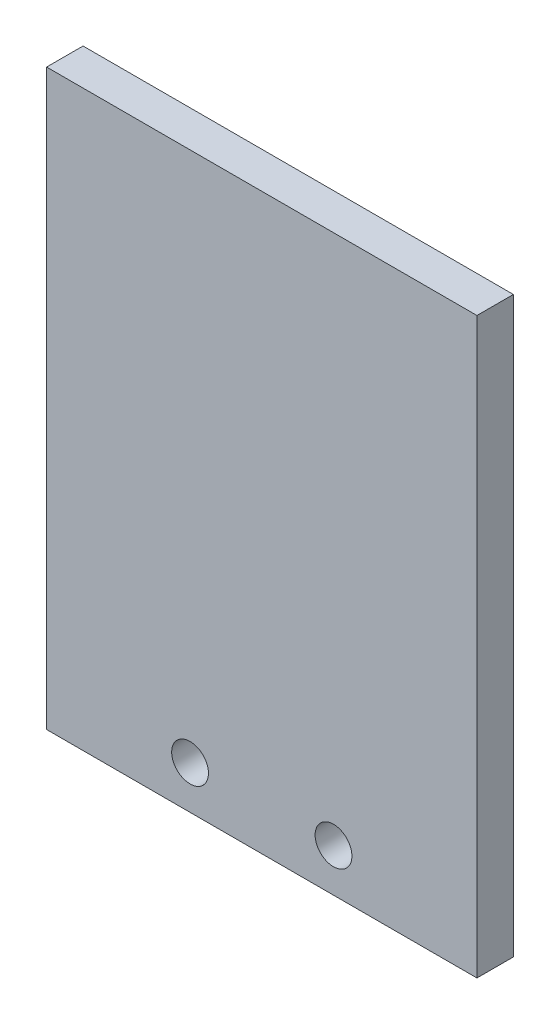
ISO-10303-21;
HEADER;
FILE_DESCRIPTION(('STEP AP214'),'2;1');
FILE_NAME('part.step','',(''),(''),'','','');
FILE_SCHEMA(('AUTOMOTIVE_DESIGN { 1 0 10303 214 1 1 1 1 }'));
ENDSEC;
DATA;
#1=APPLICATION_CONTEXT('core data for automotive mechanical design processes');
#2=APPLICATION_PROTOCOL_DEFINITION('international standard','automotive_design',2000,#1);
#3=PRODUCT_CONTEXT('',#1,'mechanical');
#4=PRODUCT('Part','Part','',(#3));
#5=PRODUCT_RELATED_PRODUCT_CATEGORY('part','',(#4));
#6=PRODUCT_DEFINITION_FORMATION('','',#4);
#7=PRODUCT_DEFINITION_CONTEXT('part definition',#1,'design');
#8=PRODUCT_DEFINITION('design','',#6,#7);
#9=PRODUCT_DEFINITION_SHAPE('','',#8);
#10=(LENGTH_UNIT() NAMED_UNIT(*) SI_UNIT(.MILLI.,.METRE.));
#11=(NAMED_UNIT(*) PLANE_ANGLE_UNIT() SI_UNIT($,.RADIAN.));
#12=(NAMED_UNIT(*) SI_UNIT($,.STERADIAN.) SOLID_ANGLE_UNIT());
#13=UNCERTAINTY_MEASURE_WITH_UNIT(LENGTH_MEASURE(1.E-05),#10,'distance_accuracy_value','');
#14=(GEOMETRIC_REPRESENTATION_CONTEXT(3) GLOBAL_UNCERTAINTY_ASSIGNED_CONTEXT((#13)) GLOBAL_UNIT_ASSIGNED_CONTEXT((#10,
#11,#12)) REPRESENTATION_CONTEXT('',''));
#15=CARTESIAN_POINT('',(0.,0.,0.));
#16=DIRECTION('',(0.,0.,1.));
#17=DIRECTION('',(1.,0.,0.));
#18=AXIS2_PLACEMENT_3D('',#15,#16,#17);
#19=CARTESIAN_POINT('',(0.,0.,12.7));
#20=DIRECTION('',(1.,0.,0.));
#21=DIRECTION('',(0.,0.,-1.));
#22=AXIS2_PLACEMENT_3D('',#19,#20,#21);
#23=PLANE('',#22);
#24=DIRECTION('',(0.,-1.,0.));
#25=VECTOR('',#24,1.);
#26=CARTESIAN_POINT('',(0.,0.,0.));
#27=LINE('',#26,#25);
#28=CARTESIAN_POINT('',(0.,200.,0.));
#29=VERTEX_POINT('',#28);
#30=CARTESIAN_POINT('',(0.,0.,0.));
#31=VERTEX_POINT('',#30);
#32=EDGE_CURVE('E96',#29,#31,#27,.T.);
#33=ORIENTED_EDGE('',*,*,#32,.T.);
#34=DIRECTION('',(0.,0.,-1.));
#35=VECTOR('',#34,1.);
#36=CARTESIAN_POINT('',(0.,0.,12.7));
#37=LINE('',#36,#35);
#38=CARTESIAN_POINT('',(0.,0.,12.7));
#39=VERTEX_POINT('',#38);
#40=EDGE_CURVE('E11',#39,#31,#37,.T.);
#41=ORIENTED_EDGE('',*,*,#40,.F.);
#42=DIRECTION('',(0.,-1.,0.));
#43=VECTOR('',#42,1.);
#44=CARTESIAN_POINT('',(0.,0.,12.7));
#45=LINE('',#44,#43);
#46=CARTESIAN_POINT('',(0.,200.,12.7));
#47=VERTEX_POINT('',#46);
#48=EDGE_CURVE('E84',#47,#39,#45,.T.);
#49=ORIENTED_EDGE('',*,*,#48,.F.);
#50=DIRECTION('',(0.,0.,-1.));
#51=VECTOR('',#50,1.);
#52=CARTESIAN_POINT('',(0.,200.,12.7));
#53=LINE('',#52,#51);
#54=EDGE_CURVE('E92',#47,#29,#53,.T.);
#55=ORIENTED_EDGE('',*,*,#54,.T.);
#56=EDGE_LOOP('',(#33,#41,#49,#55));
#57=FACE_BOUND('',#56,.T.);
#58=ADVANCED_FACE('F33',(#57),#23,.F.);
#59=CARTESIAN_POINT('',(0.,0.,12.7));
#60=DIRECTION('',(0.,1.,0.));
#61=DIRECTION('',(0.,0.,1.));
#62=AXIS2_PLACEMENT_3D('',#59,#60,#61);
#63=PLANE('',#62);
#64=DIRECTION('',(1.,0.,0.));
#65=VECTOR('',#64,1.);
#66=CARTESIAN_POINT('',(0.,0.,0.));
#67=LINE('',#66,#65);
#68=CARTESIAN_POINT('',(150.,0.,0.));
#69=VERTEX_POINT('',#68);
#70=EDGE_CURVE('E88',#31,#69,#67,.T.);
#71=ORIENTED_EDGE('',*,*,#70,.T.);
#72=DIRECTION('',(0.,0.,-1.));
#73=VECTOR('',#72,1.);
#74=CARTESIAN_POINT('',(150.,0.,12.7));
#75=LINE('',#74,#73);
#76=CARTESIAN_POINT('',(150.,0.,12.7));
#77=VERTEX_POINT('',#76);
#78=EDGE_CURVE('E41',#77,#69,#75,.T.);
#79=ORIENTED_EDGE('',*,*,#78,.F.);
#80=DIRECTION('',(1.,0.,0.));
#81=VECTOR('',#80,1.);
#82=CARTESIAN_POINT('',(0.,0.,12.7));
#83=LINE('',#82,#81);
#84=EDGE_CURVE('E79',#39,#77,#83,.T.);
#85=ORIENTED_EDGE('',*,*,#84,.F.);
#86=ORIENTED_EDGE('',*,*,#40,.T.);
#87=EDGE_LOOP('',(#71,#79,#85,#86));
#88=FACE_BOUND('',#87,.T.);
#89=ADVANCED_FACE('F87',(#88),#63,.F.);
#90=CARTESIAN_POINT('',(150.,0.,12.7));
#91=DIRECTION('',(-1.,0.,0.));
#92=DIRECTION('',(0.,0.,1.));
#93=AXIS2_PLACEMENT_3D('',#90,#91,#92);
#94=PLANE('',#93);
#95=DIRECTION('',(0.,1.,0.));
#96=VECTOR('',#95,1.);
#97=CARTESIAN_POINT('',(150.,0.,0.));
#98=LINE('',#97,#96);
#99=CARTESIAN_POINT('',(150.,200.,0.));
#100=VERTEX_POINT('',#99);
#101=EDGE_CURVE('E66',#69,#100,#98,.T.);
#102=ORIENTED_EDGE('',*,*,#101,.T.);
#103=DIRECTION('',(0.,0.,-1.));
#104=VECTOR('',#103,1.);
#105=CARTESIAN_POINT('',(150.,200.,12.7));
#106=LINE('',#105,#104);
#107=CARTESIAN_POINT('',(150.,200.,12.7));
#108=VERTEX_POINT('',#107);
#109=EDGE_CURVE('E89',#108,#100,#106,.T.);
#110=ORIENTED_EDGE('',*,*,#109,.F.);
#111=DIRECTION('',(0.,1.,0.));
#112=VECTOR('',#111,1.);
#113=CARTESIAN_POINT('',(150.,0.,12.7));
#114=LINE('',#113,#112);
#115=EDGE_CURVE('E82',#77,#108,#114,.T.);
#116=ORIENTED_EDGE('',*,*,#115,.F.);
#117=ORIENTED_EDGE('',*,*,#78,.T.);
#118=EDGE_LOOP('',(#102,#110,#116,#117));
#119=FACE_BOUND('',#118,.T.);
#120=ADVANCED_FACE('F90',(#119),#94,.F.);
#121=CARTESIAN_POINT('',(0.,200.,12.7));
#122=DIRECTION('',(0.,-1.,0.));
#123=DIRECTION('',(0.,0.,-1.));
#124=AXIS2_PLACEMENT_3D('',#121,#122,#123);
#125=PLANE('',#124);
#126=DIRECTION('',(-1.,0.,0.));
#127=VECTOR('',#126,1.);
#128=CARTESIAN_POINT('',(0.,200.,0.));
#129=LINE('',#128,#127);
#130=EDGE_CURVE('E72',#100,#29,#129,.T.);
#131=ORIENTED_EDGE('',*,*,#130,.T.);
#132=ORIENTED_EDGE('',*,*,#54,.F.);
#133=DIRECTION('',(-1.,0.,0.));
#134=VECTOR('',#133,1.);
#135=CARTESIAN_POINT('',(0.,200.,12.7));
#136=LINE('',#135,#134);
#137=EDGE_CURVE('E49',#108,#47,#136,.T.);
#138=ORIENTED_EDGE('',*,*,#137,.F.);
#139=ORIENTED_EDGE('',*,*,#109,.T.);
#140=EDGE_LOOP('',(#131,#132,#138,#139));
#141=FACE_BOUND('',#140,.T.);
#142=ADVANCED_FACE('F104',(#141),#125,.F.);
#143=CARTESIAN_POINT('',(0.,0.,12.7));
#144=DIRECTION('',(0.,0.,-1.));
#145=DIRECTION('',(-1.,0.,0.));
#146=AXIS2_PLACEMENT_3D('',#143,#144,#145);
#147=PLANE('',#146);
#148=CARTESIAN_POINT('',(100.,15.,12.7));
#149=DIRECTION('',(0.,0.,1.));
#150=DIRECTION('',(1.,0.,0.));
#151=AXIS2_PLACEMENT_3D('',#148,#149,#150);
#152=CIRCLE('',#151,6.41349999999999);
#153=CARTESIAN_POINT('',(106.4135,15.,12.7));
#154=VERTEX_POINT('',#153);
#155=EDGE_CURVE('E118',#154,#154,#152,.T.);
#156=ORIENTED_EDGE('',*,*,#155,.F.);
#157=EDGE_LOOP('',(#156));
#158=FACE_BOUND('',#157,.T.);
#159=CARTESIAN_POINT('',(50.,15.,12.7));
#160=DIRECTION('',(0.,0.,1.));
#161=DIRECTION('',(1.,0.,0.));
#162=AXIS2_PLACEMENT_3D('',#159,#160,#161);
#163=CIRCLE('',#162,6.41349999999999);
#164=CARTESIAN_POINT('',(56.4135,15.,12.7));
#165=VERTEX_POINT('',#164);
#166=EDGE_CURVE('E112',#165,#165,#163,.T.);
#167=ORIENTED_EDGE('',*,*,#166,.F.);
#168=EDGE_LOOP('',(#167));
#169=FACE_BOUND('',#168,.T.);
#170=ORIENTED_EDGE('',*,*,#48,.T.);
#171=ORIENTED_EDGE('',*,*,#84,.T.);
#172=ORIENTED_EDGE('',*,*,#115,.T.);
#173=ORIENTED_EDGE('',*,*,#137,.T.);
#174=EDGE_LOOP('',(#170,#171,#172,#173));
#175=FACE_BOUND('',#174,.T.);
#176=ADVANCED_FACE('F80',(#158,#169,#175),#147,.F.);
#177=CARTESIAN_POINT('',(0.,0.,0.));
#178=DIRECTION('',(0.,0.,-1.));
#179=DIRECTION('',(-1.,0.,0.));
#180=AXIS2_PLACEMENT_3D('',#177,#178,#179);
#181=PLANE('',#180);
#182=CARTESIAN_POINT('',(100.,15.,0.));
#183=DIRECTION('',(0.,0.,1.));
#184=DIRECTION('',(1.,0.,0.));
#185=AXIS2_PLACEMENT_3D('',#182,#183,#184);
#186=CIRCLE('',#185,6.4135);
#187=CARTESIAN_POINT('',(106.4135,15.,0.));
#188=VERTEX_POINT('',#187);
#189=EDGE_CURVE('E115',#188,#188,#186,.T.);
#190=ORIENTED_EDGE('',*,*,#189,.T.);
#191=EDGE_LOOP('',(#190));
#192=FACE_BOUND('',#191,.T.);
#193=CARTESIAN_POINT('',(50.,15.,0.));
#194=DIRECTION('',(0.,0.,1.));
#195=DIRECTION('',(1.,0.,0.));
#196=AXIS2_PLACEMENT_3D('',#193,#194,#195);
#197=CIRCLE('',#196,6.4135);
#198=CARTESIAN_POINT('',(56.4135,15.,0.));
#199=VERTEX_POINT('',#198);
#200=EDGE_CURVE('E99',#199,#199,#197,.T.);
#201=ORIENTED_EDGE('',*,*,#200,.T.);
#202=EDGE_LOOP('',(#201));
#203=FACE_BOUND('',#202,.T.);
#204=ORIENTED_EDGE('',*,*,#32,.F.);
#205=ORIENTED_EDGE('',*,*,#130,.F.);
#206=ORIENTED_EDGE('',*,*,#101,.F.);
#207=ORIENTED_EDGE('',*,*,#70,.F.);
#208=EDGE_LOOP('',(#204,#205,#206,#207));
#209=FACE_BOUND('',#208,.T.);
#210=ADVANCED_FACE('F107',(#192,#203,#209),#181,.T.);
#211=CARTESIAN_POINT('',(50.,15.,12.7));
#212=DIRECTION('',(0.,0.,1.));
#213=DIRECTION('',(1.,0.,0.));
#214=AXIS2_PLACEMENT_3D('',#211,#212,#213);
#215=CYLINDRICAL_SURFACE('',#214,6.41349999999999);
#216=ORIENTED_EDGE('',*,*,#200,.F.);
#217=EDGE_LOOP('',(#216));
#218=FACE_BOUND('',#217,.T.);
#219=ORIENTED_EDGE('',*,*,#166,.T.);
#220=EDGE_LOOP('',(#219));
#221=FACE_BOUND('',#220,.T.);
#222=ADVANCED_FACE('F129',(#218,#221),#215,.F.);
#223=CARTESIAN_POINT('',(100.,15.,12.7));
#224=DIRECTION('',(0.,0.,1.));
#225=DIRECTION('',(1.,0.,0.));
#226=AXIS2_PLACEMENT_3D('',#223,#224,#225);
#227=CYLINDRICAL_SURFACE('',#226,6.4135);
#228=ORIENTED_EDGE('',*,*,#189,.F.);
#229=EDGE_LOOP('',(#228));
#230=FACE_BOUND('',#229,.T.);
#231=ORIENTED_EDGE('',*,*,#155,.T.);
#232=EDGE_LOOP('',(#231));
#233=FACE_BOUND('',#232,.T.);
#234=ADVANCED_FACE('F122',(#230,#233),#227,.F.);
#235=CLOSED_SHELL('',(#58,#89,#120,#142,#176,#210,#222,#234));
#236=MANIFOLD_SOLID_BREP('B2',#235);
#237=ADVANCED_BREP_SHAPE_REPRESENTATION('',(#18,#236),#14);
#238=SHAPE_DEFINITION_REPRESENTATION(#9,#237);
ENDSEC;
END-ISO-10303-21;
